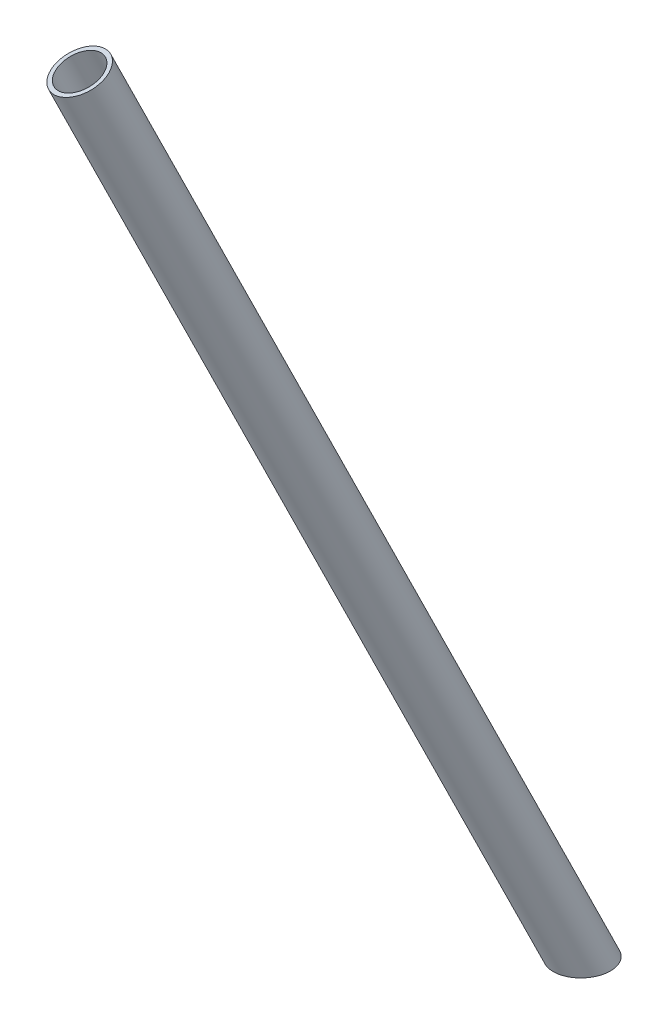
ISO-10303-21;
HEADER;
FILE_DESCRIPTION(('STEP AP214'),'2;1');
FILE_NAME('part.step','',(''),(''),'','','');
FILE_SCHEMA(('AUTOMOTIVE_DESIGN { 1 0 10303 214 1 1 1 1 }'));
ENDSEC;
DATA;
#1=APPLICATION_CONTEXT('core data for automotive mechanical design processes');
#2=APPLICATION_PROTOCOL_DEFINITION('international standard','automotive_design',2000,#1);
#3=PRODUCT_CONTEXT('',#1,'mechanical');
#4=PRODUCT('Part','Part','',(#3));
#5=PRODUCT_RELATED_PRODUCT_CATEGORY('part','',(#4));
#6=PRODUCT_DEFINITION_FORMATION('','',#4);
#7=PRODUCT_DEFINITION_CONTEXT('part definition',#1,'design');
#8=PRODUCT_DEFINITION('design','',#6,#7);
#9=PRODUCT_DEFINITION_SHAPE('','',#8);
#10=(LENGTH_UNIT() NAMED_UNIT(*) SI_UNIT(.MILLI.,.METRE.));
#11=(NAMED_UNIT(*) PLANE_ANGLE_UNIT() SI_UNIT($,.RADIAN.));
#12=(NAMED_UNIT(*) SI_UNIT($,.STERADIAN.) SOLID_ANGLE_UNIT());
#13=UNCERTAINTY_MEASURE_WITH_UNIT(LENGTH_MEASURE(1.E-05),#10,'distance_accuracy_value','');
#14=(GEOMETRIC_REPRESENTATION_CONTEXT(3) GLOBAL_UNCERTAINTY_ASSIGNED_CONTEXT((#13)) GLOBAL_UNIT_ASSIGNED_CONTEXT((#10,
#11,#12)) REPRESENTATION_CONTEXT('',''));
#15=CARTESIAN_POINT('',(0.,0.,0.));
#16=DIRECTION('',(0.,0.,1.));
#17=DIRECTION('',(1.,0.,0.));
#18=AXIS2_PLACEMENT_3D('',#15,#16,#17);
#19=CARTESIAN_POINT('',(-325.,320.,-1580.));
#20=DIRECTION('',(0.214351342090107,-0.914565726251124,-0.342962147344171));
#21=DIRECTION('',(0.620647271384696,-0.143596582877078,0.770828765620976));
#22=AXIS2_PLACEMENT_3D('',#19,#20,#21);
#23=PLANE('',#22);
#24=CARTESIAN_POINT('',(-325.,320.,-1580.));
#25=DIRECTION('',(0.214351342090107,-0.914565726251124,-0.342962147344171));
#26=DIRECTION('',(0.,0.351123441588391,-0.936329177569045));
#27=AXIS2_PLACEMENT_3D('',#24,#25,#26);
#28=CIRCLE('',#27,7.90000000000002);
#29=CARTESIAN_POINT('',(-325.,322.773875188548,-1587.3970005028));
#30=VERTEX_POINT('',#29);
#31=EDGE_CURVE('E75',#30,#30,#28,.T.);
#32=ORIENTED_EDGE('',*,*,#31,.T.);
#33=EDGE_LOOP('',(#32));
#34=FACE_BOUND('',#33,.T.);
#35=CARTESIAN_POINT('',(-325.,320.,-1580.));
#36=DIRECTION('',(0.214351342090107,-0.914565726251124,-0.342962147344171));
#37=DIRECTION('',(0.620647271384696,-0.143596582877078,0.770828765620976));
#38=AXIS2_PLACEMENT_3D('',#35,#36,#37);
#39=CIRCLE('',#38,9.49999999999999);
#40=CARTESIAN_POINT('',(-319.103850921846,318.635832462668,-1572.6771267266));
#41=VERTEX_POINT('',#40);
#42=EDGE_CURVE('E11',#41,#41,#39,.T.);
#43=ORIENTED_EDGE('',*,*,#42,.F.);
#44=EDGE_LOOP('',(#43));
#45=FACE_BOUND('',#44,.T.);
#46=ADVANCED_FACE('F41',(#34,#45),#23,.F.);
#47=CARTESIAN_POINT('',(-184.701425001453,-10.,-2002.42535625036));
#48=DIRECTION('',(0.970142500145332,0.,0.242535625036333));
#49=DIRECTION('',(0.242535625036333,0.,-0.970142500145332));
#50=AXIS2_PLACEMENT_3D('',#47,#48,#49);
#51=PLANE('',#50);
#52=CARTESIAN_POINT('',(-267.179606773407,73.2996555665365,-1672.51262916255));
#53=DIRECTION('',(0.970142500145332,0.,0.242535625036333));
#54=DIRECTION('',(-0.0940407512885348,0.921768805422756,0.376163005154139));
#55=AXIS2_PLACEMENT_3D('',#52,#53,#54);
#56=ELLIPSE('',#55,76.1396046117399,9.49999999999999);
#57=CARTESIAN_POINT('',(-261.924194176927,10.,-1693.53427954847));
#58=VERTEX_POINT('',#57);
#59=CARTESIAN_POINT('',(-260.141225962762,3.01994811422154,-1700.66615240513));
#60=VERTEX_POINT('',#59);
#61=EDGE_CURVE('E68',#58,#60,#56,.T.);
#62=ORIENTED_EDGE('',*,*,#61,.T.);
#63=DIRECTION('',(0.,-1.,0.));
#64=VECTOR('',#63,1.);
#65=CARTESIAN_POINT('',(-260.141225962762,-10.,-1700.66615240513));
#66=LINE('',#65,#64);
#67=CARTESIAN_POINT('',(-260.141225962762,10.,-1700.66615240513));
#68=VERTEX_POINT('',#67);
#69=EDGE_CURVE('E70',#68,#60,#66,.T.);
#70=ORIENTED_EDGE('',*,*,#69,.F.);
#71=DIRECTION('',(-0.242535625036333,0.,0.970142500145332));
#72=VECTOR('',#71,1.);
#73=CARTESIAN_POINT('',(-184.701425001453,10.,-2002.42535625036));
#74=LINE('',#73,#72);
#75=EDGE_CURVE('E71',#68,#58,#74,.T.);
#76=ORIENTED_EDGE('',*,*,#75,.T.);
#77=EDGE_LOOP('',(#62,#70,#76));
#78=FACE_BOUND('',#77,.T.);
#79=ADVANCED_FACE('F69',(#78),#51,.T.);
#80=CARTESIAN_POINT('',(-259.935326726564,-10.,-1698.86453408839));
#81=DIRECTION('',(0.993532672656404,0.,-0.113546591160732));
#82=DIRECTION('',(-0.113546591160732,0.,-0.993532672656404));
#83=AXIS2_PLACEMENT_3D('',#80,#81,#82);
#84=PLANE('',#83);
#85=CARTESIAN_POINT('',(-258.509137658845,36.3056540110704,-1686.38537974585));
#86=DIRECTION('',(0.993532672656404,0.,-0.113546591160732));
#87=DIRECTION('',(0.0371239312455098,0.945042024116468,0.324834398398212));
#88=AXIS2_PLACEMENT_3D('',#85,#86,#87);
#89=ELLIPSE('',#88,37.712293737374,9.49999999999999);
#90=CARTESIAN_POINT('',(-260.240282329124,10.,-1701.53289561079));
#91=VERTEX_POINT('',#90);
#92=EDGE_CURVE('E60',#60,#91,#89,.T.);
#93=ORIENTED_EDGE('',*,*,#92,.T.);
#94=DIRECTION('',(0.113546591160732,0.,0.993532672656404));
#95=VECTOR('',#94,1.);
#96=CARTESIAN_POINT('',(-259.935326726564,10.,-1698.86453408839));
#97=LINE('',#96,#95);
#98=EDGE_CURVE('E55',#91,#68,#97,.T.);
#99=ORIENTED_EDGE('',*,*,#98,.T.);
#100=ORIENTED_EDGE('',*,*,#69,.T.);
#101=EDGE_LOOP('',(#93,#99,#100));
#102=FACE_BOUND('',#101,.T.);
#103=ADVANCED_FACE('F77',(#102),#84,.T.);
#104=CARTESIAN_POINT('',(-250.,0.,-1700.));
#105=DIRECTION('',(-0.214351342090107,0.914565726251124,0.342962147344171));
#106=DIRECTION('',(0.,-0.351123441588391,0.936329177569045));
#107=AXIS2_PLACEMENT_3D('',#104,#105,#106);
#108=CYLINDRICAL_SURFACE('',#107,7.90000000000002);
#109=ORIENTED_EDGE('',*,*,#31,.F.);
#110=EDGE_LOOP('',(#109));
#111=FACE_BOUND('',#110,.T.);
#112=CARTESIAN_POINT('',(-252.34375,10.,-1696.25));
#113=DIRECTION('',(0.,-1.,0.));
#114=DIRECTION('',(-0.52999894000318,0.,0.847998304005088));
#115=AXIS2_PLACEMENT_3D('',#112,#113,#114);
#116=ELLIPSE('',#115,8.63797950572971,7.90000000000002);
#117=CARTESIAN_POINT('',(-256.921869981806,10.,-1688.92500802911));
#118=VERTEX_POINT('',#117);
#119=EDGE_CURVE('E78',#118,#118,#116,.T.);
#120=ORIENTED_EDGE('',*,*,#119,.T.);
#121=EDGE_LOOP('',(#120));
#122=FACE_BOUND('',#121,.T.);
#123=ADVANCED_FACE('F92',(#111,#122),#108,.F.);
#124=CARTESIAN_POINT('',(259.935326726564,10.,-1698.86453408839));
#125=DIRECTION('',(0.,-1.,0.));
#126=DIRECTION('',(0.,0.,-1.));
#127=AXIS2_PLACEMENT_3D('',#124,#125,#126);
#128=PLANE('',#127);
#129=ORIENTED_EDGE('',*,*,#119,.F.);
#130=EDGE_LOOP('',(#129));
#131=FACE_BOUND('',#130,.T.);
#132=CARTESIAN_POINT('',(-252.34375,10.,-1696.25));
#133=DIRECTION('',(0.,-1.,0.));
#134=DIRECTION('',(-0.52999894000318,0.,0.847998304005088));
#135=AXIS2_PLACEMENT_3D('',#132,#133,#134);
#136=ELLIPSE('',#135,10.3874437094218,9.49999999999999);
#137=EDGE_CURVE('E48',#91,#58,#136,.T.);
#138=ORIENTED_EDGE('',*,*,#137,.T.);
#139=ORIENTED_EDGE('',*,*,#75,.F.);
#140=ORIENTED_EDGE('',*,*,#98,.F.);
#141=EDGE_LOOP('',(#138,#139,#140));
#142=FACE_BOUND('',#141,.T.);
#143=ADVANCED_FACE('F90',(#131,#142),#128,.T.);
#144=CARTESIAN_POINT('',(-250.,0.,-1700.));
#145=DIRECTION('',(-0.214351342090107,0.914565726251124,0.342962147344171));
#146=DIRECTION('',(0.,-0.351123441588391,0.936329177569045));
#147=AXIS2_PLACEMENT_3D('',#144,#145,#146);
#148=CYLINDRICAL_SURFACE('',#147,9.49999999999999);
#149=ORIENTED_EDGE('',*,*,#42,.T.);
#150=EDGE_LOOP('',(#149));
#151=FACE_BOUND('',#150,.T.);
#152=ORIENTED_EDGE('',*,*,#137,.F.);
#153=ORIENTED_EDGE('',*,*,#92,.F.);
#154=ORIENTED_EDGE('',*,*,#61,.F.);
#155=EDGE_LOOP('',(#152,#153,#154));
#156=FACE_BOUND('',#155,.T.);
#157=ADVANCED_FACE('F80',(#151,#156),#148,.T.);
#158=CLOSED_SHELL('',(#46,#79,#103,#123,#143,#157));
#159=MANIFOLD_SOLID_BREP('B2',#158);
#160=ADVANCED_BREP_SHAPE_REPRESENTATION('',(#18,#159),#14);
#161=SHAPE_DEFINITION_REPRESENTATION(#9,#160);
ENDSEC;
END-ISO-10303-21;
